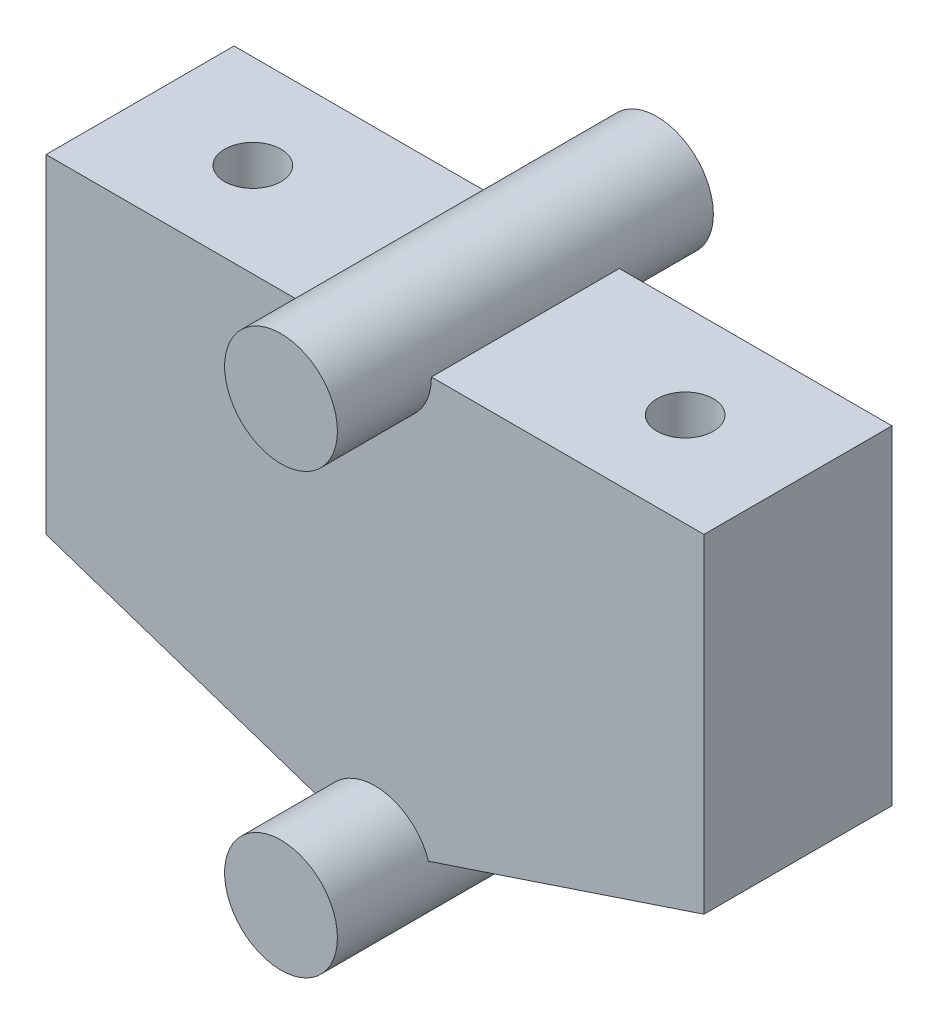
ISO-10303-21;
HEADER;
FILE_DESCRIPTION(('STEP AP214'),'2;1');
FILE_NAME('part.step','',(''),(''),'','','');
FILE_SCHEMA(('AUTOMOTIVE_DESIGN { 1 0 10303 214 1 1 1 1 }'));
ENDSEC;
DATA;
#1=APPLICATION_CONTEXT('core data for automotive mechanical design processes');
#2=APPLICATION_PROTOCOL_DEFINITION('international standard','automotive_design',2000,#1);
#3=PRODUCT_CONTEXT('',#1,'mechanical');
#4=PRODUCT('Part','Part','',(#3));
#5=PRODUCT_RELATED_PRODUCT_CATEGORY('part','',(#4));
#6=PRODUCT_DEFINITION_FORMATION('','',#4);
#7=PRODUCT_DEFINITION_CONTEXT('part definition',#1,'design');
#8=PRODUCT_DEFINITION('design','',#6,#7);
#9=PRODUCT_DEFINITION_SHAPE('','',#8);
#10=(LENGTH_UNIT() NAMED_UNIT(*) SI_UNIT(.MILLI.,.METRE.));
#11=(NAMED_UNIT(*) PLANE_ANGLE_UNIT() SI_UNIT($,.RADIAN.));
#12=(NAMED_UNIT(*) SI_UNIT($,.STERADIAN.) SOLID_ANGLE_UNIT());
#13=UNCERTAINTY_MEASURE_WITH_UNIT(LENGTH_MEASURE(1.E-05),#10,'distance_accuracy_value','');
#14=(GEOMETRIC_REPRESENTATION_CONTEXT(3) GLOBAL_UNCERTAINTY_ASSIGNED_CONTEXT((#13)) GLOBAL_UNIT_ASSIGNED_CONTEXT((#10,
#11,#12)) REPRESENTATION_CONTEXT('',''));
#15=CARTESIAN_POINT('',(0.,0.,0.));
#16=DIRECTION('',(0.,0.,1.));
#17=DIRECTION('',(1.,0.,0.));
#18=AXIS2_PLACEMENT_3D('',#15,#16,#17);
#19=CARTESIAN_POINT('',(0.,8.75,10.));
#20=DIRECTION('',(0.,1.,0.));
#21=DIRECTION('',(0.,0.,1.));
#22=AXIS2_PLACEMENT_3D('',#19,#20,#21);
#23=PLANE('',#22);
#24=DIRECTION('',(0.,0.,1.));
#25=VECTOR('',#24,1.);
#26=CARTESIAN_POINT('',(-3.,8.75,-5.));
#27=LINE('',#26,#25);
#28=CARTESIAN_POINT('',(-3.,8.75,0.));
#29=VERTEX_POINT('',#28);
#30=CARTESIAN_POINT('',(-3.,8.75,10.));
#31=VERTEX_POINT('',#30);
#32=EDGE_CURVE('E112',#29,#31,#27,.T.);
#33=ORIENTED_EDGE('',*,*,#32,.F.);
#34=DIRECTION('',(1.,0.,0.));
#35=VECTOR('',#34,1.);
#36=CARTESIAN_POINT('',(0.,8.75,0.));
#37=LINE('',#36,#35);
#38=CARTESIAN_POINT('',(-17.5,8.75,0.));
#39=VERTEX_POINT('',#38);
#40=EDGE_CURVE('E121',#39,#29,#37,.T.);
#41=ORIENTED_EDGE('',*,*,#40,.F.);
#42=DIRECTION('',(0.,0.,-1.));
#43=VECTOR('',#42,1.);
#44=CARTESIAN_POINT('',(-17.5,8.75,10.));
#45=LINE('',#44,#43);
#46=CARTESIAN_POINT('',(-17.5,8.75,10.));
#47=VERTEX_POINT('',#46);
#48=EDGE_CURVE('E144',#47,#39,#45,.T.);
#49=ORIENTED_EDGE('',*,*,#48,.F.);
#50=DIRECTION('',(1.,0.,0.));
#51=VECTOR('',#50,1.);
#52=CARTESIAN_POINT('',(0.,8.75,10.));
#53=LINE('',#52,#51);
#54=EDGE_CURVE('E122',#47,#31,#53,.T.);
#55=ORIENTED_EDGE('',*,*,#54,.T.);
#56=EDGE_LOOP('',(#33,#41,#49,#55));
#57=FACE_BOUND('',#56,.T.);
#58=CARTESIAN_POINT('',(-11.5,8.75,5.));
#59=DIRECTION('',(0.,1.,0.));
#60=DIRECTION('',(-1.,0.,0.));
#61=AXIS2_PLACEMENT_3D('',#58,#59,#60);
#62=CIRCLE('',#61,1.5);
#63=CARTESIAN_POINT('',(-13.,8.75,5.));
#64=VERTEX_POINT('',#63);
#65=EDGE_CURVE('E155',#64,#64,#62,.T.);
#66=ORIENTED_EDGE('',*,*,#65,.F.);
#67=EDGE_LOOP('',(#66));
#68=FACE_BOUND('',#67,.T.);
#69=ADVANCED_FACE('F37',(#57,#68),#23,.T.);
#70=CARTESIAN_POINT('',(4.375,-13.125,10.));
#71=DIRECTION('',(-0.316227766016838,0.948683298050514,0.));
#72=DIRECTION('',(-0.948683298050514,-0.316227766016838,0.));
#73=AXIS2_PLACEMENT_3D('',#70,#71,#72);
#74=PLANE('',#73);
#75=CARTESIAN_POINT('',(11.5,-10.75,5.));
#76=DIRECTION('',(-0.316227766016838,0.948683298050514,0.));
#77=DIRECTION('',(0.948683298050514,0.316227766016838,0.));
#78=AXIS2_PLACEMENT_3D('',#75,#76,#77);
#79=ELLIPSE('',#78,1.58113883008419,1.5);
#80=CARTESIAN_POINT('',(13.,-10.25,5.));
#81=VERTEX_POINT('',#80);
#82=EDGE_CURVE('E154',#81,#81,#79,.T.);
#83=ORIENTED_EDGE('',*,*,#82,.T.);
#84=EDGE_LOOP('',(#83));
#85=FACE_BOUND('',#84,.T.);
#86=DIRECTION('',(0.948683298050514,0.316227766016838,0.));
#87=VECTOR('',#86,1.);
#88=CARTESIAN_POINT('',(4.375,-13.125,0.));
#89=LINE('',#88,#87);
#90=CARTESIAN_POINT('',(2.84604989415154,-13.6346500352828,0.));
#91=VERTEX_POINT('',#90);
#92=CARTESIAN_POINT('',(17.5,-8.75,0.));
#93=VERTEX_POINT('',#92);
#94=EDGE_CURVE('E186',#91,#93,#89,.T.);
#95=ORIENTED_EDGE('',*,*,#94,.T.);
#96=DIRECTION('',(0.,0.,-1.));
#97=VECTOR('',#96,1.);
#98=CARTESIAN_POINT('',(17.5,-8.75,10.));
#99=LINE('',#98,#97);
#100=CARTESIAN_POINT('',(17.5,-8.75,10.));
#101=VERTEX_POINT('',#100);
#102=EDGE_CURVE('E149',#101,#93,#99,.T.);
#103=ORIENTED_EDGE('',*,*,#102,.F.);
#104=DIRECTION('',(0.948683298050514,0.316227766016838,0.));
#105=VECTOR('',#104,1.);
#106=CARTESIAN_POINT('',(4.375,-13.125,10.));
#107=LINE('',#106,#105);
#108=CARTESIAN_POINT('',(2.84604989415154,-13.6346500352828,10.));
#109=VERTEX_POINT('',#108);
#110=EDGE_CURVE('E93',#109,#101,#107,.T.);
#111=ORIENTED_EDGE('',*,*,#110,.F.);
#112=DIRECTION('',(0.,0.,-1.));
#113=VECTOR('',#112,1.);
#114=CARTESIAN_POINT('',(2.84604989415154,-13.6346500352828,10.));
#115=LINE('',#114,#113);
#116=EDGE_CURVE('E45',#109,#91,#115,.T.);
#117=ORIENTED_EDGE('',*,*,#116,.T.);
#118=EDGE_LOOP('',(#95,#103,#111,#117));
#119=FACE_BOUND('',#118,.T.);
#120=ADVANCED_FACE('F39',(#85,#119),#74,.F.);
#121=CARTESIAN_POINT('',(17.5,0.,10.));
#122=DIRECTION('',(1.,0.,0.));
#123=DIRECTION('',(0.,1.,0.));
#124=AXIS2_PLACEMENT_3D('',#121,#122,#123);
#125=PLANE('',#124);
#126=DIRECTION('',(0.,-1.,0.));
#127=VECTOR('',#126,1.);
#128=CARTESIAN_POINT('',(17.5,0.,0.));
#129=LINE('',#128,#127);
#130=CARTESIAN_POINT('',(17.5,8.75,0.));
#131=VERTEX_POINT('',#130);
#132=EDGE_CURVE('E133',#131,#93,#129,.T.);
#133=ORIENTED_EDGE('',*,*,#132,.F.);
#134=DIRECTION('',(0.,0.,-1.));
#135=VECTOR('',#134,1.);
#136=CARTESIAN_POINT('',(17.5,8.75,10.));
#137=LINE('',#136,#135);
#138=CARTESIAN_POINT('',(17.5,8.75,10.));
#139=VERTEX_POINT('',#138);
#140=EDGE_CURVE('E146',#139,#131,#137,.T.);
#141=ORIENTED_EDGE('',*,*,#140,.F.);
#142=DIRECTION('',(0.,-1.,0.));
#143=VECTOR('',#142,1.);
#144=CARTESIAN_POINT('',(17.5,0.,10.));
#145=LINE('',#144,#143);
#146=EDGE_CURVE('E178',#139,#101,#145,.T.);
#147=ORIENTED_EDGE('',*,*,#146,.T.);
#148=ORIENTED_EDGE('',*,*,#102,.T.);
#149=EDGE_LOOP('',(#133,#141,#147,#148));
#150=FACE_BOUND('',#149,.T.);
#151=ADVANCED_FACE('F194',(#150),#125,.T.);
#152=DIRECTION('',(0.,0.,1.));
#153=VECTOR('',#152,1.);
#154=CARTESIAN_POINT('',(3.,8.75,-5.));
#155=LINE('',#154,#153);
#156=CARTESIAN_POINT('',(3.,8.75,10.));
#157=VERTEX_POINT('',#156);
#158=CARTESIAN_POINT('',(3.,8.75,0.));
#159=VERTEX_POINT('',#158);
#160=EDGE_CURVE('E52',#157,#159,#155,.F.);
#161=ORIENTED_EDGE('',*,*,#160,.F.);
#162=EDGE_CURVE('E181',#157,#139,#53,.T.);
#163=ORIENTED_EDGE('',*,*,#162,.T.);
#164=ORIENTED_EDGE('',*,*,#140,.T.);
#165=EDGE_CURVE('E129',#159,#131,#37,.T.);
#166=ORIENTED_EDGE('',*,*,#165,.F.);
#167=EDGE_LOOP('',(#161,#163,#164,#166));
#168=FACE_BOUND('',#167,.T.);
#169=CARTESIAN_POINT('',(11.5,8.75,5.));
#170=DIRECTION('',(0.,1.,0.));
#171=DIRECTION('',(1.,0.,0.));
#172=AXIS2_PLACEMENT_3D('',#169,#170,#171);
#173=CIRCLE('',#172,1.5);
#174=CARTESIAN_POINT('',(13.,8.75,5.));
#175=VERTEX_POINT('',#174);
#176=EDGE_CURVE('E162',#175,#175,#173,.T.);
#177=ORIENTED_EDGE('',*,*,#176,.F.);
#178=EDGE_LOOP('',(#177));
#179=FACE_BOUND('',#178,.T.);
#180=ADVANCED_FACE('F205',(#168,#179),#23,.T.);
#181=CARTESIAN_POINT('',(-17.5,0.,10.));
#182=DIRECTION('',(1.,0.,0.));
#183=DIRECTION('',(0.,1.,0.));
#184=AXIS2_PLACEMENT_3D('',#181,#182,#183);
#185=PLANE('',#184);
#186=DIRECTION('',(0.,-1.,0.));
#187=VECTOR('',#186,1.);
#188=CARTESIAN_POINT('',(-17.5,0.,0.));
#189=LINE('',#188,#187);
#190=CARTESIAN_POINT('',(-17.5,-8.75,0.));
#191=VERTEX_POINT('',#190);
#192=EDGE_CURVE('E128',#39,#191,#189,.T.);
#193=ORIENTED_EDGE('',*,*,#192,.T.);
#194=DIRECTION('',(0.,0.,-1.));
#195=VECTOR('',#194,1.);
#196=CARTESIAN_POINT('',(-17.5,-8.75,10.));
#197=LINE('',#196,#195);
#198=CARTESIAN_POINT('',(-17.5,-8.75,10.));
#199=VERTEX_POINT('',#198);
#200=EDGE_CURVE('E140',#199,#191,#197,.T.);
#201=ORIENTED_EDGE('',*,*,#200,.F.);
#202=DIRECTION('',(0.,-1.,0.));
#203=VECTOR('',#202,1.);
#204=CARTESIAN_POINT('',(-17.5,0.,10.));
#205=LINE('',#204,#203);
#206=EDGE_CURVE('E60',#47,#199,#205,.T.);
#207=ORIENTED_EDGE('',*,*,#206,.F.);
#208=ORIENTED_EDGE('',*,*,#48,.T.);
#209=EDGE_LOOP('',(#193,#201,#207,#208));
#210=FACE_BOUND('',#209,.T.);
#211=ADVANCED_FACE('F202',(#210),#185,.F.);
#212=CARTESIAN_POINT('',(-4.375,-13.125,10.));
#213=DIRECTION('',(0.316227766016838,0.948683298050514,0.));
#214=DIRECTION('',(-0.948683298050514,0.316227766016838,0.));
#215=AXIS2_PLACEMENT_3D('',#212,#213,#214);
#216=PLANE('',#215);
#217=CARTESIAN_POINT('',(-11.5,-10.75,5.));
#218=DIRECTION('',(0.316227766016838,0.948683298050514,0.));
#219=DIRECTION('',(-0.948683298050514,0.316227766016838,0.));
#220=AXIS2_PLACEMENT_3D('',#217,#218,#219);
#221=ELLIPSE('',#220,1.58113883008419,1.5);
#222=CARTESIAN_POINT('',(-13.,-10.25,5.));
#223=VERTEX_POINT('',#222);
#224=EDGE_CURVE('E152',#223,#223,#221,.T.);
#225=ORIENTED_EDGE('',*,*,#224,.T.);
#226=EDGE_LOOP('',(#225));
#227=FACE_BOUND('',#226,.T.);
#228=DIRECTION('',(0.948683298050514,-0.316227766016838,0.));
#229=VECTOR('',#228,1.);
#230=CARTESIAN_POINT('',(-4.375,-13.125,0.));
#231=LINE('',#230,#229);
#232=CARTESIAN_POINT('',(-2.84604989415154,-13.6346500352828,0.));
#233=VERTEX_POINT('',#232);
#234=EDGE_CURVE('E131',#191,#233,#231,.T.);
#235=ORIENTED_EDGE('',*,*,#234,.T.);
#236=DIRECTION('',(0.,0.,-1.));
#237=VECTOR('',#236,1.);
#238=CARTESIAN_POINT('',(-2.84604989415154,-13.6346500352828,10.));
#239=LINE('',#238,#237);
#240=CARTESIAN_POINT('',(-2.84604989415154,-13.6346500352828,10.));
#241=VERTEX_POINT('',#240);
#242=EDGE_CURVE('E86',#241,#233,#239,.T.);
#243=ORIENTED_EDGE('',*,*,#242,.F.);
#244=DIRECTION('',(0.948683298050514,-0.316227766016838,0.));
#245=VECTOR('',#244,1.);
#246=CARTESIAN_POINT('',(-4.375,-13.125,10.));
#247=LINE('',#246,#245);
#248=EDGE_CURVE('E141',#199,#241,#247,.T.);
#249=ORIENTED_EDGE('',*,*,#248,.F.);
#250=ORIENTED_EDGE('',*,*,#200,.T.);
#251=EDGE_LOOP('',(#235,#243,#249,#250));
#252=FACE_BOUND('',#251,.T.);
#253=ADVANCED_FACE('F200',(#227,#252),#216,.F.);
#254=CARTESIAN_POINT('',(0.,0.,10.));
#255=DIRECTION('',(0.,0.,1.));
#256=DIRECTION('',(1.,0.,0.));
#257=AXIS2_PLACEMENT_3D('',#254,#255,#256);
#258=PLANE('',#257);
#259=CARTESIAN_POINT('',(0.,8.75,10.));
#260=DIRECTION('',(0.,0.,1.));
#261=DIRECTION('',(1.,0.,0.));
#262=AXIS2_PLACEMENT_3D('',#259,#260,#261);
#263=CIRCLE('',#262,3.);
#264=EDGE_CURVE('E123',#31,#157,#263,.T.);
#265=ORIENTED_EDGE('',*,*,#264,.F.);
#266=ORIENTED_EDGE('',*,*,#54,.F.);
#267=ORIENTED_EDGE('',*,*,#206,.T.);
#268=ORIENTED_EDGE('',*,*,#248,.T.);
#269=CARTESIAN_POINT('',(0.,-14.5833333333333,10.));
#270=DIRECTION('',(0.,0.,1.));
#271=DIRECTION('',(1.,0.,0.));
#272=AXIS2_PLACEMENT_3D('',#269,#270,#271);
#273=CIRCLE('',#272,3.);
#274=EDGE_CURVE('E138',#109,#241,#273,.T.);
#275=ORIENTED_EDGE('',*,*,#274,.F.);
#276=ORIENTED_EDGE('',*,*,#110,.T.);
#277=ORIENTED_EDGE('',*,*,#146,.F.);
#278=ORIENTED_EDGE('',*,*,#162,.F.);
#279=EDGE_LOOP('',(#265,#266,#267,#268,#275,#276,#277,#278));
#280=FACE_BOUND('',#279,.T.);
#281=ADVANCED_FACE('F195',(#280),#258,.T.);
#282=CARTESIAN_POINT('',(0.,0.,0.));
#283=DIRECTION('',(0.,0.,1.));
#284=DIRECTION('',(1.,0.,0.));
#285=AXIS2_PLACEMENT_3D('',#282,#283,#284);
#286=PLANE('',#285);
#287=ORIENTED_EDGE('',*,*,#40,.T.);
#288=CARTESIAN_POINT('',(0.,8.75,0.));
#289=DIRECTION('',(0.,0.,1.));
#290=DIRECTION('',(1.,0.,0.));
#291=AXIS2_PLACEMENT_3D('',#288,#289,#290);
#292=CIRCLE('',#291,3.);
#293=EDGE_CURVE('E11',#29,#159,#292,.T.);
#294=ORIENTED_EDGE('',*,*,#293,.T.);
#295=ORIENTED_EDGE('',*,*,#165,.T.);
#296=ORIENTED_EDGE('',*,*,#132,.T.);
#297=ORIENTED_EDGE('',*,*,#94,.F.);
#298=CARTESIAN_POINT('',(0.,-14.5833333333333,0.));
#299=DIRECTION('',(0.,0.,1.));
#300=DIRECTION('',(1.,0.,0.));
#301=AXIS2_PLACEMENT_3D('',#298,#299,#300);
#302=CIRCLE('',#301,3.);
#303=EDGE_CURVE('E175',#91,#233,#302,.T.);
#304=ORIENTED_EDGE('',*,*,#303,.T.);
#305=ORIENTED_EDGE('',*,*,#234,.F.);
#306=ORIENTED_EDGE('',*,*,#192,.F.);
#307=EDGE_LOOP('',(#287,#294,#295,#296,#297,#304,#305,#306));
#308=FACE_BOUND('',#307,.T.);
#309=ADVANCED_FACE('F126',(#308),#286,.F.);
#310=CARTESIAN_POINT('',(0.,-14.5833333333333,-5.));
#311=DIRECTION('',(0.,0.,1.));
#312=DIRECTION('',(1.,0.,0.));
#313=AXIS2_PLACEMENT_3D('',#310,#311,#312);
#314=CYLINDRICAL_SURFACE('',#313,3.);
#315=ORIENTED_EDGE('',*,*,#116,.F.);
#316=ORIENTED_EDGE('',*,*,#274,.T.);
#317=ORIENTED_EDGE('',*,*,#242,.T.);
#318=ORIENTED_EDGE('',*,*,#303,.F.);
#319=EDGE_LOOP('',(#315,#316,#317,#318));
#320=FACE_BOUND('',#319,.T.);
#321=CARTESIAN_POINT('',(0.,-14.5833333333333,-5.));
#322=DIRECTION('',(0.,0.,1.));
#323=DIRECTION('',(1.,0.,0.));
#324=AXIS2_PLACEMENT_3D('',#321,#322,#323);
#325=CIRCLE('',#324,3.);
#326=CARTESIAN_POINT('',(3.,-14.5833333333333,-5.));
#327=VERTEX_POINT('',#326);
#328=EDGE_CURVE('E172',#327,#327,#325,.T.);
#329=ORIENTED_EDGE('',*,*,#328,.T.);
#330=EDGE_LOOP('',(#329));
#331=FACE_BOUND('',#330,.T.);
#332=CARTESIAN_POINT('',(0.,-14.5833333333333,15.));
#333=DIRECTION('',(0.,0.,1.));
#334=DIRECTION('',(1.,0.,0.));
#335=AXIS2_PLACEMENT_3D('',#332,#333,#334);
#336=CIRCLE('',#335,3.);
#337=CARTESIAN_POINT('',(3.,-14.5833333333333,15.));
#338=VERTEX_POINT('',#337);
#339=EDGE_CURVE('E159',#338,#338,#336,.T.);
#340=ORIENTED_EDGE('',*,*,#339,.F.);
#341=EDGE_LOOP('',(#340));
#342=FACE_BOUND('',#341,.T.);
#343=ADVANCED_FACE('F197',(#320,#331,#342),#314,.T.);
#344=CARTESIAN_POINT('',(0.,0.,-5.));
#345=DIRECTION('',(0.,0.,1.));
#346=DIRECTION('',(1.,0.,0.));
#347=AXIS2_PLACEMENT_3D('',#344,#345,#346);
#348=PLANE('',#347);
#349=ORIENTED_EDGE('',*,*,#328,.F.);
#350=EDGE_LOOP('',(#349));
#351=FACE_BOUND('',#350,.T.);
#352=ADVANCED_FACE('F330',(#351),#348,.F.);
#353=CARTESIAN_POINT('',(0.,0.,15.));
#354=DIRECTION('',(0.,0.,1.));
#355=DIRECTION('',(1.,0.,0.));
#356=AXIS2_PLACEMENT_3D('',#353,#354,#355);
#357=PLANE('',#356);
#358=ORIENTED_EDGE('',*,*,#339,.T.);
#359=EDGE_LOOP('',(#358));
#360=FACE_BOUND('',#359,.T.);
#361=ADVANCED_FACE('F257',(#360),#357,.T.);
#362=CARTESIAN_POINT('',(-11.5,-17.5833333333333,5.));
#363=DIRECTION('',(0.,1.,0.));
#364=DIRECTION('',(-1.,0.,0.));
#365=AXIS2_PLACEMENT_3D('',#362,#363,#364);
#366=CYLINDRICAL_SURFACE('',#365,1.5);
#367=ORIENTED_EDGE('',*,*,#65,.T.);
#368=EDGE_LOOP('',(#367));
#369=FACE_BOUND('',#368,.T.);
#370=ORIENTED_EDGE('',*,*,#224,.F.);
#371=EDGE_LOOP('',(#370));
#372=FACE_BOUND('',#371,.T.);
#373=ADVANCED_FACE('F228',(#369,#372),#366,.F.);
#374=CARTESIAN_POINT('',(11.5,-17.5833333333333,5.));
#375=DIRECTION('',(0.,1.,0.));
#376=DIRECTION('',(-1.,0.,0.));
#377=AXIS2_PLACEMENT_3D('',#374,#375,#376);
#378=CYLINDRICAL_SURFACE('',#377,1.5);
#379=ORIENTED_EDGE('',*,*,#176,.T.);
#380=EDGE_LOOP('',(#379));
#381=FACE_BOUND('',#380,.T.);
#382=ORIENTED_EDGE('',*,*,#82,.F.);
#383=EDGE_LOOP('',(#382));
#384=FACE_BOUND('',#383,.T.);
#385=ADVANCED_FACE('F220',(#381,#384),#378,.F.);
#386=CARTESIAN_POINT('',(0.,8.75,-5.));
#387=DIRECTION('',(0.,0.,1.));
#388=DIRECTION('',(1.,0.,0.));
#389=AXIS2_PLACEMENT_3D('',#386,#387,#388);
#390=CYLINDRICAL_SURFACE('',#389,3.);
#391=ORIENTED_EDGE('',*,*,#32,.T.);
#392=ORIENTED_EDGE('',*,*,#264,.T.);
#393=ORIENTED_EDGE('',*,*,#160,.T.);
#394=ORIENTED_EDGE('',*,*,#293,.F.);
#395=EDGE_LOOP('',(#391,#392,#393,#394));
#396=FACE_BOUND('',#395,.T.);
#397=CARTESIAN_POINT('',(0.,8.75,-5.));
#398=DIRECTION('',(0.,0.,1.));
#399=DIRECTION('',(1.,0.,0.));
#400=AXIS2_PLACEMENT_3D('',#397,#398,#399);
#401=CIRCLE('',#400,3.);
#402=CARTESIAN_POINT('',(3.,8.75,-5.));
#403=VERTEX_POINT('',#402);
#404=EDGE_CURVE('E207',#403,#403,#401,.T.);
#405=ORIENTED_EDGE('',*,*,#404,.T.);
#406=EDGE_LOOP('',(#405));
#407=FACE_BOUND('',#406,.T.);
#408=CARTESIAN_POINT('',(0.,8.75,15.));
#409=DIRECTION('',(0.,0.,1.));
#410=DIRECTION('',(1.,0.,0.));
#411=AXIS2_PLACEMENT_3D('',#408,#409,#410);
#412=CIRCLE('',#411,3.);
#413=CARTESIAN_POINT('',(3.,8.75,15.));
#414=VERTEX_POINT('',#413);
#415=EDGE_CURVE('E210',#414,#414,#412,.T.);
#416=ORIENTED_EDGE('',*,*,#415,.F.);
#417=EDGE_LOOP('',(#416));
#418=FACE_BOUND('',#417,.T.);
#419=ADVANCED_FACE('F110',(#396,#407,#418),#390,.T.);
#420=CARTESIAN_POINT('',(0.,8.75,-5.));
#421=DIRECTION('',(0.,0.,1.));
#422=DIRECTION('',(1.,0.,0.));
#423=AXIS2_PLACEMENT_3D('',#420,#421,#422);
#424=PLANE('',#423);
#425=ORIENTED_EDGE('',*,*,#404,.F.);
#426=EDGE_LOOP('',(#425));
#427=FACE_BOUND('',#426,.T.);
#428=ADVANCED_FACE('F219',(#427),#424,.F.);
#429=CARTESIAN_POINT('',(0.,8.75,15.));
#430=DIRECTION('',(0.,0.,1.));
#431=DIRECTION('',(1.,0.,0.));
#432=AXIS2_PLACEMENT_3D('',#429,#430,#431);
#433=PLANE('',#432);
#434=ORIENTED_EDGE('',*,*,#415,.T.);
#435=EDGE_LOOP('',(#434));
#436=FACE_BOUND('',#435,.T.);
#437=ADVANCED_FACE('F216',(#436),#433,.T.);
#438=CLOSED_SHELL('',(#69,#120,#151,#180,#211,#253,#281,#309,#343,#352,#361,#373,#385,#419,#428,#437));
#439=MANIFOLD_SOLID_BREP('B2',#438);
#440=ADVANCED_BREP_SHAPE_REPRESENTATION('',(#18,#439),#14);
#441=SHAPE_DEFINITION_REPRESENTATION(#9,#440);
ENDSEC;
END-ISO-10303-21;
